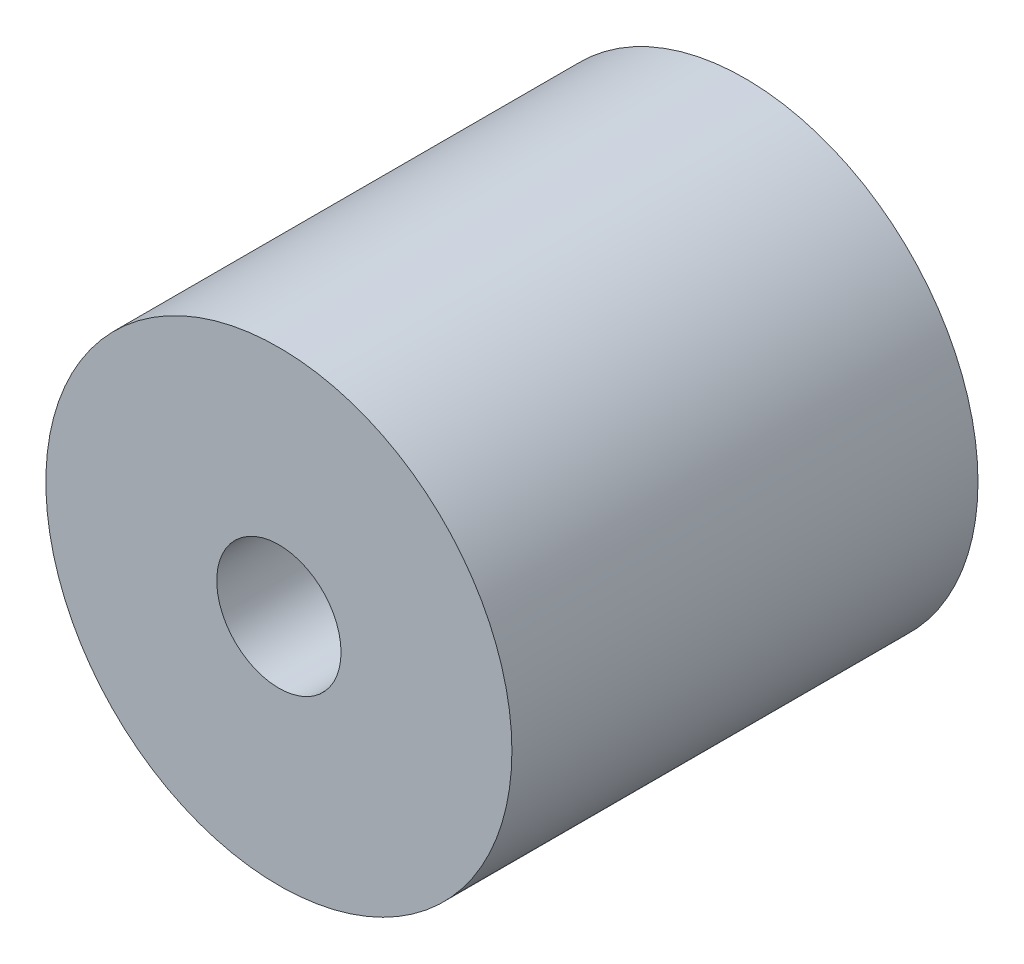
ISO-10303-21;
HEADER;
FILE_DESCRIPTION(('STEP AP214'),'2;1');
FILE_NAME('part.step','',(''),(''),'','','');
FILE_SCHEMA(('AUTOMOTIVE_DESIGN { 1 0 10303 214 1 1 1 1 }'));
ENDSEC;
DATA;
#1=APPLICATION_CONTEXT('core data for automotive mechanical design processes');
#2=APPLICATION_PROTOCOL_DEFINITION('international standard','automotive_design',2000,#1);
#3=PRODUCT_CONTEXT('',#1,'mechanical');
#4=PRODUCT('Part','Part','',(#3));
#5=PRODUCT_RELATED_PRODUCT_CATEGORY('part','',(#4));
#6=PRODUCT_DEFINITION_FORMATION('','',#4);
#7=PRODUCT_DEFINITION_CONTEXT('part definition',#1,'design');
#8=PRODUCT_DEFINITION('design','',#6,#7);
#9=PRODUCT_DEFINITION_SHAPE('','',#8);
#10=(LENGTH_UNIT() NAMED_UNIT(*) SI_UNIT(.MILLI.,.METRE.));
#11=(NAMED_UNIT(*) PLANE_ANGLE_UNIT() SI_UNIT($,.RADIAN.));
#12=(NAMED_UNIT(*) SI_UNIT($,.STERADIAN.) SOLID_ANGLE_UNIT());
#13=UNCERTAINTY_MEASURE_WITH_UNIT(LENGTH_MEASURE(1.E-05),#10,'distance_accuracy_value','');
#14=(GEOMETRIC_REPRESENTATION_CONTEXT(3) GLOBAL_UNCERTAINTY_ASSIGNED_CONTEXT((#13)) GLOBAL_UNIT_ASSIGNED_CONTEXT((#10,
#11,#12)) REPRESENTATION_CONTEXT('',''));
#15=CARTESIAN_POINT('',(0.,0.,0.));
#16=DIRECTION('',(0.,0.,1.));
#17=DIRECTION('',(1.,0.,0.));
#18=AXIS2_PLACEMENT_3D('',#15,#16,#17);
#19=CARTESIAN_POINT('',(0.,0.,15.));
#20=DIRECTION('',(0.,0.,-1.));
#21=DIRECTION('',(-1.,0.,0.));
#22=AXIS2_PLACEMENT_3D('',#19,#20,#21);
#23=CYLINDRICAL_SURFACE('',#22,15.);
#24=CARTESIAN_POINT('',(0.,0.,15.));
#25=DIRECTION('',(0.,0.,1.));
#26=DIRECTION('',(1.,0.,0.));
#27=AXIS2_PLACEMENT_3D('',#24,#25,#26);
#28=CIRCLE('',#27,15.);
#29=CARTESIAN_POINT('',(15.,0.,15.));
#30=VERTEX_POINT('',#29);
#31=EDGE_CURVE('E10',#30,#30,#28,.T.);
#32=ORIENTED_EDGE('',*,*,#31,.F.);
#33=EDGE_LOOP('',(#32));
#34=FACE_BOUND('',#33,.T.);
#35=CARTESIAN_POINT('',(0.,0.,-15.));
#36=DIRECTION('',(0.,0.,1.));
#37=DIRECTION('',(1.,0.,0.));
#38=AXIS2_PLACEMENT_3D('',#35,#36,#37);
#39=CIRCLE('',#38,15.);
#40=CARTESIAN_POINT('',(15.,0.,-15.));
#41=VERTEX_POINT('',#40);
#42=EDGE_CURVE('E32',#41,#41,#39,.T.);
#43=ORIENTED_EDGE('',*,*,#42,.T.);
#44=EDGE_LOOP('',(#43));
#45=FACE_BOUND('',#44,.T.);
#46=ADVANCED_FACE('F29',(#34,#45),#23,.T.);
#47=CARTESIAN_POINT('',(0.,0.,15.));
#48=DIRECTION('',(0.,0.,1.));
#49=DIRECTION('',(1.,0.,0.));
#50=AXIS2_PLACEMENT_3D('',#47,#48,#49);
#51=PLANE('',#50);
#52=CARTESIAN_POINT('',(0.,0.,15.));
#53=DIRECTION('',(0.,0.,1.));
#54=DIRECTION('',(1.,0.,0.));
#55=AXIS2_PLACEMENT_3D('',#52,#53,#54);
#56=CIRCLE('',#55,4.);
#57=CARTESIAN_POINT('',(4.,0.,15.));
#58=VERTEX_POINT('',#57);
#59=EDGE_CURVE('E41',#58,#58,#56,.T.);
#60=ORIENTED_EDGE('',*,*,#59,.F.);
#61=EDGE_LOOP('',(#60));
#62=FACE_BOUND('',#61,.T.);
#63=ORIENTED_EDGE('',*,*,#31,.T.);
#64=EDGE_LOOP('',(#63));
#65=FACE_BOUND('',#64,.T.);
#66=ADVANCED_FACE('F56',(#62,#65),#51,.T.);
#67=CARTESIAN_POINT('',(0.,0.,-15.));
#68=DIRECTION('',(0.,0.,1.));
#69=DIRECTION('',(1.,0.,0.));
#70=AXIS2_PLACEMENT_3D('',#67,#68,#69);
#71=PLANE('',#70);
#72=CARTESIAN_POINT('',(0.,0.,-15.));
#73=DIRECTION('',(0.,0.,1.));
#74=DIRECTION('',(1.,0.,0.));
#75=AXIS2_PLACEMENT_3D('',#72,#73,#74);
#76=CIRCLE('',#75,4.);
#77=CARTESIAN_POINT('',(4.,0.,-15.));
#78=VERTEX_POINT('',#77);
#79=EDGE_CURVE('E39',#78,#78,#76,.T.);
#80=ORIENTED_EDGE('',*,*,#79,.T.);
#81=EDGE_LOOP('',(#80));
#82=FACE_BOUND('',#81,.T.);
#83=ORIENTED_EDGE('',*,*,#42,.F.);
#84=EDGE_LOOP('',(#83));
#85=FACE_BOUND('',#84,.T.);
#86=ADVANCED_FACE('F47',(#82,#85),#71,.F.);
#87=CARTESIAN_POINT('',(0.,0.,-15.));
#88=DIRECTION('',(0.,0.,1.));
#89=DIRECTION('',(1.,0.,0.));
#90=AXIS2_PLACEMENT_3D('',#87,#88,#89);
#91=CYLINDRICAL_SURFACE('',#90,4.);
#92=ORIENTED_EDGE('',*,*,#79,.F.);
#93=EDGE_LOOP('',(#92));
#94=FACE_BOUND('',#93,.T.);
#95=ORIENTED_EDGE('',*,*,#59,.T.);
#96=EDGE_LOOP('',(#95));
#97=FACE_BOUND('',#96,.T.);
#98=ADVANCED_FACE('F50',(#94,#97),#91,.F.);
#99=CLOSED_SHELL('',(#46,#66,#86,#98));
#100=MANIFOLD_SOLID_BREP('B2',#99);
#101=ADVANCED_BREP_SHAPE_REPRESENTATION('',(#18,#100),#14);
#102=SHAPE_DEFINITION_REPRESENTATION(#9,#101);
ENDSEC;
END-ISO-10303-21;
